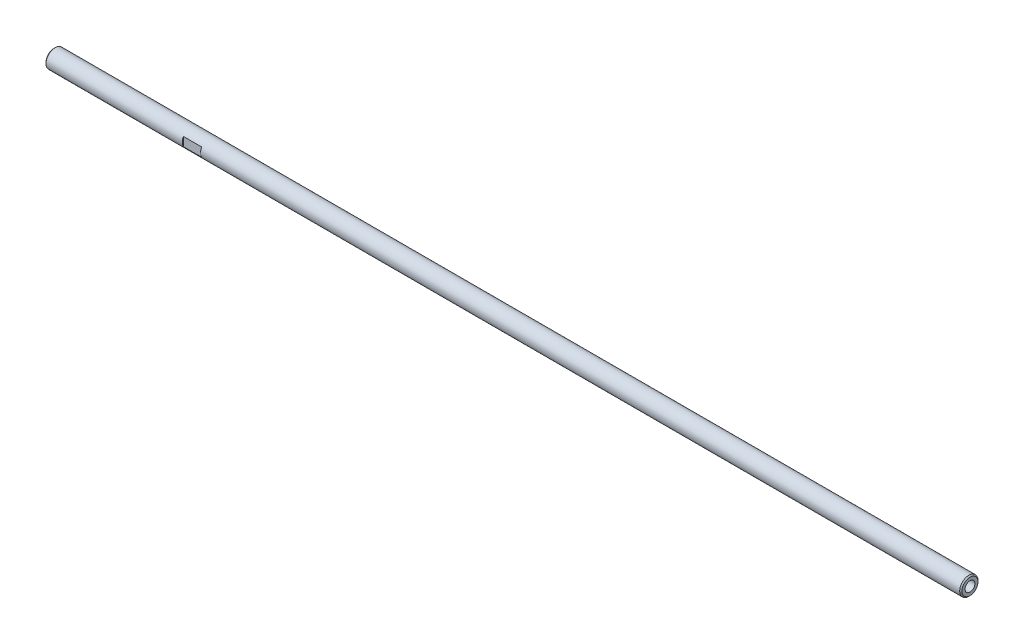
ISO-10303-21;
HEADER;
FILE_DESCRIPTION(('STEP AP214'),'2;1');
FILE_NAME('part.step','',(''),(''),'','','');
FILE_SCHEMA(('AUTOMOTIVE_DESIGN { 1 0 10303 214 1 1 1 1 }'));
ENDSEC;
DATA;
#1=APPLICATION_CONTEXT('core data for automotive mechanical design processes');
#2=APPLICATION_PROTOCOL_DEFINITION('international standard','automotive_design',2000,#1);
#3=PRODUCT_CONTEXT('',#1,'mechanical');
#4=PRODUCT('Part','Part','',(#3));
#5=PRODUCT_RELATED_PRODUCT_CATEGORY('part','',(#4));
#6=PRODUCT_DEFINITION_FORMATION('','',#4);
#7=PRODUCT_DEFINITION_CONTEXT('part definition',#1,'design');
#8=PRODUCT_DEFINITION('design','',#6,#7);
#9=PRODUCT_DEFINITION_SHAPE('','',#8);
#10=(LENGTH_UNIT() NAMED_UNIT(*) SI_UNIT(.MILLI.,.METRE.));
#11=(NAMED_UNIT(*) PLANE_ANGLE_UNIT() SI_UNIT($,.RADIAN.));
#12=(NAMED_UNIT(*) SI_UNIT($,.STERADIAN.) SOLID_ANGLE_UNIT());
#13=UNCERTAINTY_MEASURE_WITH_UNIT(LENGTH_MEASURE(1.E-05),#10,'distance_accuracy_value','');
#14=(GEOMETRIC_REPRESENTATION_CONTEXT(3) GLOBAL_UNCERTAINTY_ASSIGNED_CONTEXT((#13)) GLOBAL_UNIT_ASSIGNED_CONTEXT((#10,
#11,#12)) REPRESENTATION_CONTEXT('',''));
#15=CARTESIAN_POINT('',(0.,0.,0.));
#16=DIRECTION('',(0.,0.,1.));
#17=DIRECTION('',(1.,0.,0.));
#18=AXIS2_PLACEMENT_3D('',#15,#16,#17);
#19=CARTESIAN_POINT('',(0.,0.,0.));
#20=DIRECTION('',(-1.,0.,0.));
#21=DIRECTION('',(0.,0.,1.));
#22=AXIS2_PLACEMENT_3D('',#19,#20,#21);
#23=CYLINDRICAL_SURFACE('',#22,4.);
#24=CARTESIAN_POINT('',(199.5,0.,0.));
#25=DIRECTION('',(1.,0.,0.));
#26=DIRECTION('',(0.,0.,-1.));
#27=AXIS2_PLACEMENT_3D('',#24,#25,#26);
#28=CIRCLE('',#27,4.);
#29=CARTESIAN_POINT('',(199.5,0.,-4.));
#30=VERTEX_POINT('',#29);
#31=EDGE_CURVE('E164',#30,#30,#28,.F.);
#32=ORIENTED_EDGE('',*,*,#31,.T.);
#33=EDGE_LOOP('',(#32));
#34=FACE_BOUND('',#33,.T.);
#35=CARTESIAN_POINT('',(-199.5,0.,0.));
#36=DIRECTION('',(1.,0.,0.));
#37=DIRECTION('',(0.,0.,-1.));
#38=AXIS2_PLACEMENT_3D('',#35,#36,#37);
#39=CIRCLE('',#38,4.);
#40=CARTESIAN_POINT('',(-199.5,0.,-4.));
#41=VERTEX_POINT('',#40);
#42=EDGE_CURVE('E160',#41,#41,#39,.T.);
#43=ORIENTED_EDGE('',*,*,#42,.T.);
#44=EDGE_LOOP('',(#43));
#45=FACE_BOUND('',#44,.T.);
#46=CARTESIAN_POINT('',(-140.,0.,0.));
#47=DIRECTION('',(-1.,0.,0.));
#48=DIRECTION('',(0.,0.,1.));
#49=AXIS2_PLACEMENT_3D('',#46,#47,#48);
#50=CIRCLE('',#49,4.);
#51=CARTESIAN_POINT('',(-140.,-1.93649167310371,-3.5));
#52=VERTEX_POINT('',#51);
#53=CARTESIAN_POINT('',(-140.,1.93649167310371,-3.5));
#54=VERTEX_POINT('',#53);
#55=EDGE_CURVE('E108',#52,#54,#50,.F.);
#56=ORIENTED_EDGE('',*,*,#55,.F.);
#57=DIRECTION('',(-1.,0.,0.));
#58=VECTOR('',#57,1.);
#59=CARTESIAN_POINT('',(0.,-1.93649167310371,-3.5));
#60=LINE('',#59,#58);
#61=CARTESIAN_POINT('',(-132.,-1.93649167310371,-3.5));
#62=VERTEX_POINT('',#61);
#63=EDGE_CURVE('E95',#52,#62,#60,.F.);
#64=ORIENTED_EDGE('',*,*,#63,.T.);
#65=CARTESIAN_POINT('',(-132.,0.,0.));
#66=DIRECTION('',(-1.,0.,0.));
#67=DIRECTION('',(0.,0.,1.));
#68=AXIS2_PLACEMENT_3D('',#65,#66,#67);
#69=CIRCLE('',#68,4.);
#70=CARTESIAN_POINT('',(-132.,1.93649167310371,-3.5));
#71=VERTEX_POINT('',#70);
#72=EDGE_CURVE('E104',#62,#71,#69,.F.);
#73=ORIENTED_EDGE('',*,*,#72,.T.);
#74=DIRECTION('',(-1.,0.,0.));
#75=VECTOR('',#74,1.);
#76=CARTESIAN_POINT('',(0.,1.93649167310371,-3.5));
#77=LINE('',#76,#75);
#78=EDGE_CURVE('E114',#71,#54,#77,.T.);
#79=ORIENTED_EDGE('',*,*,#78,.T.);
#80=EDGE_LOOP('',(#56,#64,#73,#79));
#81=FACE_BOUND('',#80,.T.);
#82=CARTESIAN_POINT('',(-140.,1.93649167310371,3.5));
#83=VERTEX_POINT('',#82);
#84=CARTESIAN_POINT('',(-140.,-1.93649167310371,3.5));
#85=VERTEX_POINT('',#84);
#86=EDGE_CURVE('E117',#83,#85,#50,.F.);
#87=ORIENTED_EDGE('',*,*,#86,.F.);
#88=DIRECTION('',(-1.,0.,0.));
#89=VECTOR('',#88,1.);
#90=CARTESIAN_POINT('',(0.,1.93649167310371,3.5));
#91=LINE('',#90,#89);
#92=CARTESIAN_POINT('',(-132.,1.93649167310371,3.5));
#93=VERTEX_POINT('',#92);
#94=EDGE_CURVE('E12',#83,#93,#91,.F.);
#95=ORIENTED_EDGE('',*,*,#94,.T.);
#96=CARTESIAN_POINT('',(-132.,-1.93649167310371,3.5));
#97=VERTEX_POINT('',#96);
#98=EDGE_CURVE('E57',#93,#97,#69,.F.);
#99=ORIENTED_EDGE('',*,*,#98,.T.);
#100=DIRECTION('',(-1.,0.,0.));
#101=VECTOR('',#100,1.);
#102=CARTESIAN_POINT('',(0.,-1.93649167310371,3.5));
#103=LINE('',#102,#101);
#104=EDGE_CURVE('E103',#97,#85,#103,.T.);
#105=ORIENTED_EDGE('',*,*,#104,.T.);
#106=EDGE_LOOP('',(#87,#95,#99,#105));
#107=FACE_BOUND('',#106,.T.);
#108=ADVANCED_FACE('F48',(#34,#45,#81,#107),#23,.T.);
#109=CARTESIAN_POINT('',(190.,0.,0.));
#110=DIRECTION('',(1.,0.,0.));
#111=DIRECTION('',(0.,0.,-1.));
#112=AXIS2_PLACEMENT_3D('',#109,#110,#111);
#113=CONICAL_SURFACE('',#112,2.15000000000002,1.02974425867665);
#114=CARTESIAN_POINT('',(188.708149669091,0.,0.));
#115=VERTEX_POINT('',#114);
#116=VERTEX_LOOP('',#115);
#117=FACE_BOUND('',#116,.T.);
#118=CARTESIAN_POINT('',(190.,0.,0.));
#119=DIRECTION('',(-1.,0.,0.));
#120=DIRECTION('',(0.,0.,1.));
#121=AXIS2_PLACEMENT_3D('',#118,#119,#120);
#122=CIRCLE('',#121,2.15000000000002);
#123=CARTESIAN_POINT('',(190.,0.,2.15000000000002));
#124=VERTEX_POINT('',#123);
#125=EDGE_CURVE('E156',#124,#124,#122,.T.);
#126=ORIENTED_EDGE('',*,*,#125,.F.);
#127=EDGE_LOOP('',(#126));
#128=FACE_BOUND('',#127,.T.);
#129=ADVANCED_FACE('F188',(#117,#128),#113,.F.);
#130=CARTESIAN_POINT('',(0.,0.,0.));
#131=DIRECTION('',(-1.,0.,0.));
#132=DIRECTION('',(0.,0.,1.));
#133=AXIS2_PLACEMENT_3D('',#130,#131,#132);
#134=CYLINDRICAL_SURFACE('',#133,2.15000000000002);
#135=ORIENTED_EDGE('',*,*,#125,.T.);
#136=EDGE_LOOP('',(#135));
#137=FACE_BOUND('',#136,.T.);
#138=CARTESIAN_POINT('',(200.,0.,0.));
#139=DIRECTION('',(-1.,0.,0.));
#140=DIRECTION('',(0.,0.,1.));
#141=AXIS2_PLACEMENT_3D('',#138,#139,#140);
#142=CIRCLE('',#141,2.15000000000002);
#143=CARTESIAN_POINT('',(200.,0.,2.15000000000002));
#144=VERTEX_POINT('',#143);
#145=EDGE_CURVE('E152',#144,#144,#142,.T.);
#146=ORIENTED_EDGE('',*,*,#145,.F.);
#147=EDGE_LOOP('',(#146));
#148=FACE_BOUND('',#147,.T.);
#149=ADVANCED_FACE('F193',(#137,#148),#134,.F.);
#150=CARTESIAN_POINT('',(200.,0.,0.));
#151=DIRECTION('',(1.,0.,0.));
#152=DIRECTION('',(0.,0.,-1.));
#153=AXIS2_PLACEMENT_3D('',#150,#151,#152);
#154=PLANE('',#153);
#155=CARTESIAN_POINT('',(200.,0.,0.));
#156=DIRECTION('',(1.,0.,0.));
#157=DIRECTION('',(0.,0.,-1.));
#158=AXIS2_PLACEMENT_3D('',#155,#156,#157);
#159=CIRCLE('',#158,3.49999999999989);
#160=CARTESIAN_POINT('',(200.,0.,-3.49999999999989));
#161=VERTEX_POINT('',#160);
#162=EDGE_CURVE('E167',#161,#161,#159,.T.);
#163=ORIENTED_EDGE('',*,*,#162,.T.);
#164=EDGE_LOOP('',(#163));
#165=FACE_BOUND('',#164,.T.);
#166=ORIENTED_EDGE('',*,*,#145,.T.);
#167=EDGE_LOOP('',(#166));
#168=FACE_BOUND('',#167,.T.);
#169=ADVANCED_FACE('F200',(#165,#168),#154,.T.);
#170=CARTESIAN_POINT('',(-200.,0.,0.));
#171=DIRECTION('',(1.,0.,0.));
#172=DIRECTION('',(0.,0.,-1.));
#173=AXIS2_PLACEMENT_3D('',#170,#171,#172);
#174=PLANE('',#173);
#175=CARTESIAN_POINT('',(-200.,0.,0.));
#176=DIRECTION('',(1.,0.,0.));
#177=DIRECTION('',(0.,0.,-1.));
#178=AXIS2_PLACEMENT_3D('',#175,#176,#177);
#179=CIRCLE('',#178,3.5);
#180=CARTESIAN_POINT('',(-200.,0.,-3.5));
#181=VERTEX_POINT('',#180);
#182=EDGE_CURVE('E121',#181,#181,#179,.F.);
#183=ORIENTED_EDGE('',*,*,#182,.T.);
#184=EDGE_LOOP('',(#183));
#185=FACE_BOUND('',#184,.T.);
#186=CARTESIAN_POINT('',(-200.,0.,0.));
#187=DIRECTION('',(-1.,0.,0.));
#188=DIRECTION('',(0.,0.,1.));
#189=AXIS2_PLACEMENT_3D('',#186,#187,#188);
#190=CIRCLE('',#189,2.15);
#191=CARTESIAN_POINT('',(-200.,0.,2.15));
#192=VERTEX_POINT('',#191);
#193=EDGE_CURVE('E149',#192,#192,#190,.T.);
#194=ORIENTED_EDGE('',*,*,#193,.F.);
#195=EDGE_LOOP('',(#194));
#196=FACE_BOUND('',#195,.T.);
#197=ADVANCED_FACE('F174',(#185,#196),#174,.F.);
#198=CARTESIAN_POINT('',(0.,0.,0.));
#199=DIRECTION('',(-1.,0.,0.));
#200=DIRECTION('',(0.,0.,1.));
#201=AXIS2_PLACEMENT_3D('',#198,#199,#200);
#202=CYLINDRICAL_SURFACE('',#201,2.15);
#203=CARTESIAN_POINT('',(-190.,0.,0.));
#204=DIRECTION('',(-1.,0.,0.));
#205=DIRECTION('',(0.,0.,1.));
#206=AXIS2_PLACEMENT_3D('',#203,#204,#205);
#207=CIRCLE('',#206,2.15);
#208=CARTESIAN_POINT('',(-190.,0.,2.15));
#209=VERTEX_POINT('',#208);
#210=EDGE_CURVE('E141',#209,#209,#207,.T.);
#211=ORIENTED_EDGE('',*,*,#210,.F.);
#212=EDGE_LOOP('',(#211));
#213=FACE_BOUND('',#212,.T.);
#214=ORIENTED_EDGE('',*,*,#193,.T.);
#215=EDGE_LOOP('',(#214));
#216=FACE_BOUND('',#215,.T.);
#217=ADVANCED_FACE('F223',(#213,#216),#202,.F.);
#218=CARTESIAN_POINT('',(-190.,0.,0.));
#219=DIRECTION('',(-1.,0.,0.));
#220=DIRECTION('',(0.,0.,1.));
#221=AXIS2_PLACEMENT_3D('',#218,#219,#220);
#222=CONICAL_SURFACE('',#221,2.15,1.02974425867664);
#223=CARTESIAN_POINT('',(-188.708149669091,0.,0.));
#224=VERTEX_POINT('',#223);
#225=VERTEX_LOOP('',#224);
#226=FACE_BOUND('',#225,.T.);
#227=ORIENTED_EDGE('',*,*,#210,.T.);
#228=EDGE_LOOP('',(#227));
#229=FACE_BOUND('',#228,.T.);
#230=ADVANCED_FACE('F184',(#226,#229),#222,.F.);
#231=CARTESIAN_POINT('',(199.5,0.,0.));
#232=DIRECTION('',(-1.,0.,0.));
#233=DIRECTION('',(0.,0.,1.));
#234=AXIS2_PLACEMENT_3D('',#231,#232,#233);
#235=CONICAL_SURFACE('',#234,4.,0.7853981633975);
#236=ORIENTED_EDGE('',*,*,#162,.F.);
#237=EDGE_LOOP('',(#236));
#238=FACE_BOUND('',#237,.T.);
#239=ORIENTED_EDGE('',*,*,#31,.F.);
#240=EDGE_LOOP('',(#239));
#241=FACE_BOUND('',#240,.T.);
#242=ADVANCED_FACE('F178',(#238,#241),#235,.T.);
#243=CARTESIAN_POINT('',(-200.,0.,0.));
#244=DIRECTION('',(1.,0.,0.));
#245=DIRECTION('',(0.,0.,-1.));
#246=AXIS2_PLACEMENT_3D('',#243,#244,#245);
#247=CONICAL_SURFACE('',#246,3.5,0.785398163397445);
#248=ORIENTED_EDGE('',*,*,#42,.F.);
#249=EDGE_LOOP('',(#248));
#250=FACE_BOUND('',#249,.T.);
#251=ORIENTED_EDGE('',*,*,#182,.F.);
#252=EDGE_LOOP('',(#251));
#253=FACE_BOUND('',#252,.T.);
#254=ADVANCED_FACE('F50',(#250,#253),#247,.T.);
#255=CARTESIAN_POINT('',(-132.,-4.,-3.5));
#256=DIRECTION('',(0.,0.,-1.));
#257=DIRECTION('',(-1.,0.,0.));
#258=AXIS2_PLACEMENT_3D('',#255,#256,#257);
#259=PLANE('',#258);
#260=DIRECTION('',(0.,-1.,0.));
#261=VECTOR('',#260,1.);
#262=CARTESIAN_POINT('',(-140.,-4.,-3.5));
#263=LINE('',#262,#261);
#264=EDGE_CURVE('E72',#54,#52,#263,.T.);
#265=ORIENTED_EDGE('',*,*,#264,.F.);
#266=ORIENTED_EDGE('',*,*,#78,.F.);
#267=DIRECTION('',(0.,-1.,0.));
#268=VECTOR('',#267,1.);
#269=CARTESIAN_POINT('',(-132.,-4.,-3.5));
#270=LINE('',#269,#268);
#271=EDGE_CURVE('E98',#71,#62,#270,.T.);
#272=ORIENTED_EDGE('',*,*,#271,.T.);
#273=ORIENTED_EDGE('',*,*,#63,.F.);
#274=EDGE_LOOP('',(#265,#266,#272,#273));
#275=FACE_BOUND('',#274,.T.);
#276=ADVANCED_FACE('F96',(#275),#259,.T.);
#277=CARTESIAN_POINT('',(-140.,0.,0.));
#278=DIRECTION('',(-1.,0.,0.));
#279=DIRECTION('',(0.,0.,1.));
#280=AXIS2_PLACEMENT_3D('',#277,#278,#279);
#281=PLANE('',#280);
#282=ORIENTED_EDGE('',*,*,#55,.T.);
#283=ORIENTED_EDGE('',*,*,#264,.T.);
#284=EDGE_LOOP('',(#282,#283));
#285=FACE_BOUND('',#284,.T.);
#286=ADVANCED_FACE('F107',(#285),#281,.F.);
#287=CARTESIAN_POINT('',(-132.,0.,0.));
#288=DIRECTION('',(-1.,0.,0.));
#289=DIRECTION('',(0.,0.,1.));
#290=AXIS2_PLACEMENT_3D('',#287,#288,#289);
#291=PLANE('',#290);
#292=ORIENTED_EDGE('',*,*,#271,.F.);
#293=ORIENTED_EDGE('',*,*,#72,.F.);
#294=EDGE_LOOP('',(#292,#293));
#295=FACE_BOUND('',#294,.T.);
#296=ADVANCED_FACE('F257',(#295),#291,.T.);
#297=DIRECTION('',(0.,1.,0.));
#298=VECTOR('',#297,1.);
#299=CARTESIAN_POINT('',(-132.,-4.,3.5));
#300=LINE('',#299,#298);
#301=EDGE_CURVE('E111',#97,#93,#300,.T.);
#302=ORIENTED_EDGE('',*,*,#301,.F.);
#303=ORIENTED_EDGE('',*,*,#98,.F.);
#304=EDGE_LOOP('',(#302,#303));
#305=FACE_BOUND('',#304,.T.);
#306=ADVANCED_FACE('F136',(#305),#291,.T.);
#307=ORIENTED_EDGE('',*,*,#86,.T.);
#308=DIRECTION('',(0.,1.,0.));
#309=VECTOR('',#308,1.);
#310=CARTESIAN_POINT('',(-140.,-4.,3.5));
#311=LINE('',#310,#309);
#312=EDGE_CURVE('E64',#85,#83,#311,.T.);
#313=ORIENTED_EDGE('',*,*,#312,.T.);
#314=EDGE_LOOP('',(#307,#313));
#315=FACE_BOUND('',#314,.T.);
#316=ADVANCED_FACE('F259',(#315),#281,.F.);
#317=CARTESIAN_POINT('',(-132.,-4.,3.5));
#318=DIRECTION('',(0.,0.,1.));
#319=DIRECTION('',(1.,0.,0.));
#320=AXIS2_PLACEMENT_3D('',#317,#318,#319);
#321=PLANE('',#320);
#322=ORIENTED_EDGE('',*,*,#312,.F.);
#323=ORIENTED_EDGE('',*,*,#104,.F.);
#324=ORIENTED_EDGE('',*,*,#301,.T.);
#325=ORIENTED_EDGE('',*,*,#94,.F.);
#326=EDGE_LOOP('',(#322,#323,#324,#325));
#327=FACE_BOUND('',#326,.T.);
#328=ADVANCED_FACE('F134',(#327),#321,.T.);
#329=CLOSED_SHELL('',(#108,#129,#149,#169,#197,#217,#230,#242,#254,#276,#286,#296,#306,#316,#328));
#330=MANIFOLD_SOLID_BREP('B2',#329);
#331=ADVANCED_BREP_SHAPE_REPRESENTATION('',(#18,#330),#14);
#332=SHAPE_DEFINITION_REPRESENTATION(#9,#331);
ENDSEC;
END-ISO-10303-21;
